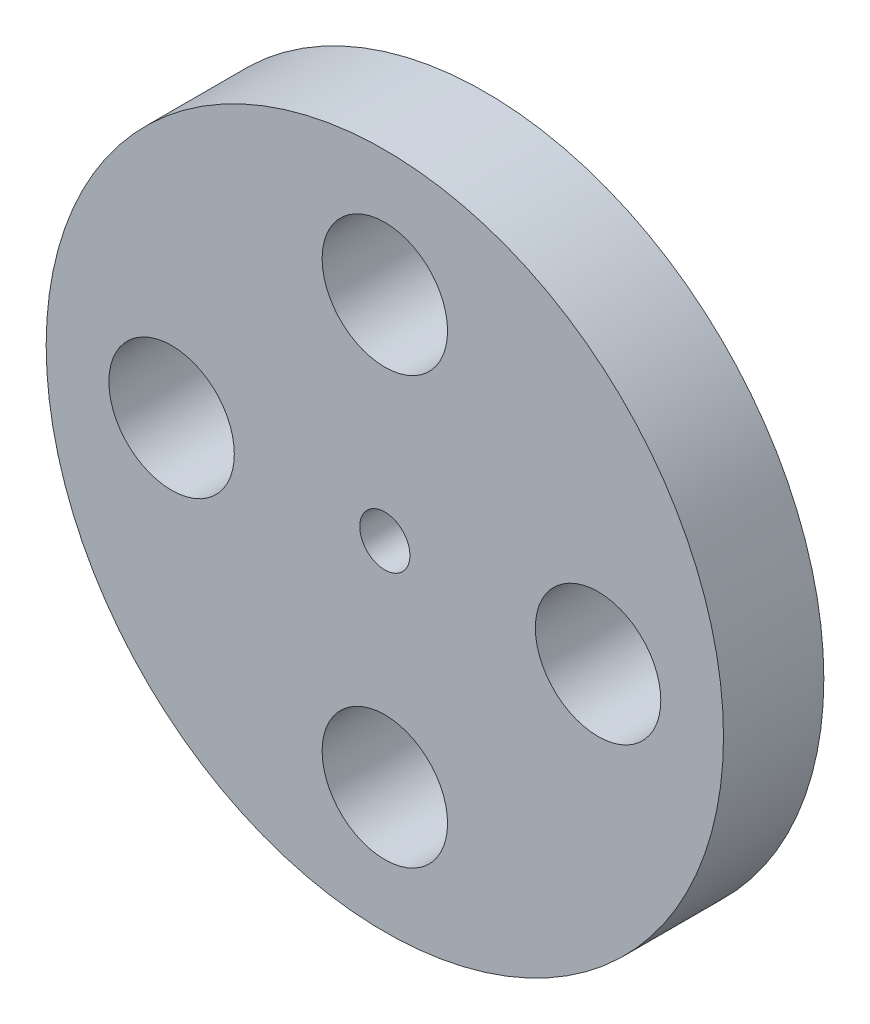
ISO-10303-21;
HEADER;
FILE_DESCRIPTION(('STEP AP214'),'2;1');
FILE_NAME('part.step','',(''),(''),'','','');
FILE_SCHEMA(('AUTOMOTIVE_DESIGN { 1 0 10303 214 1 1 1 1 }'));
ENDSEC;
DATA;
#1=APPLICATION_CONTEXT('core data for automotive mechanical design processes');
#2=APPLICATION_PROTOCOL_DEFINITION('international standard','automotive_design',2000,#1);
#3=PRODUCT_CONTEXT('',#1,'mechanical');
#4=PRODUCT('Part','Part','',(#3));
#5=PRODUCT_RELATED_PRODUCT_CATEGORY('part','',(#4));
#6=PRODUCT_DEFINITION_FORMATION('','',#4);
#7=PRODUCT_DEFINITION_CONTEXT('part definition',#1,'design');
#8=PRODUCT_DEFINITION('design','',#6,#7);
#9=PRODUCT_DEFINITION_SHAPE('','',#8);
#10=(LENGTH_UNIT() NAMED_UNIT(*) SI_UNIT(.MILLI.,.METRE.));
#11=(NAMED_UNIT(*) PLANE_ANGLE_UNIT() SI_UNIT($,.RADIAN.));
#12=(NAMED_UNIT(*) SI_UNIT($,.STERADIAN.) SOLID_ANGLE_UNIT());
#13=UNCERTAINTY_MEASURE_WITH_UNIT(LENGTH_MEASURE(1.E-05),#10,'distance_accuracy_value','');
#14=(GEOMETRIC_REPRESENTATION_CONTEXT(3) GLOBAL_UNCERTAINTY_ASSIGNED_CONTEXT((#13)) GLOBAL_UNIT_ASSIGNED_CONTEXT((#10,
#11,#12)) REPRESENTATION_CONTEXT('',''));
#15=CARTESIAN_POINT('',(0.,0.,0.));
#16=DIRECTION('',(0.,0.,1.));
#17=DIRECTION('',(1.,0.,0.));
#18=AXIS2_PLACEMENT_3D('',#15,#16,#17);
#19=CARTESIAN_POINT('',(0.,0.,4.));
#20=DIRECTION('',(0.,0.,-1.));
#21=DIRECTION('',(-1.,0.,0.));
#22=AXIS2_PLACEMENT_3D('',#19,#20,#21);
#23=CYLINDRICAL_SURFACE('',#22,13.5);
#24=CARTESIAN_POINT('',(0.,0.,4.));
#25=DIRECTION('',(0.,0.,1.));
#26=DIRECTION('',(1.,0.,0.));
#27=AXIS2_PLACEMENT_3D('',#24,#25,#26);
#28=CIRCLE('',#27,13.5);
#29=CARTESIAN_POINT('',(13.5,0.,4.));
#30=VERTEX_POINT('',#29);
#31=EDGE_CURVE('E10',#30,#30,#28,.T.);
#32=ORIENTED_EDGE('',*,*,#31,.F.);
#33=EDGE_LOOP('',(#32));
#34=FACE_BOUND('',#33,.T.);
#35=CARTESIAN_POINT('',(0.,0.,0.));
#36=DIRECTION('',(0.,0.,1.));
#37=DIRECTION('',(1.,0.,0.));
#38=AXIS2_PLACEMENT_3D('',#35,#36,#37);
#39=CIRCLE('',#38,13.5);
#40=CARTESIAN_POINT('',(13.5,0.,0.));
#41=VERTEX_POINT('',#40);
#42=EDGE_CURVE('E34',#41,#41,#39,.T.);
#43=ORIENTED_EDGE('',*,*,#42,.T.);
#44=EDGE_LOOP('',(#43));
#45=FACE_BOUND('',#44,.T.);
#46=ADVANCED_FACE('F31',(#34,#45),#23,.T.);
#47=CARTESIAN_POINT('',(0.,0.,4.));
#48=DIRECTION('',(0.,0.,1.));
#49=DIRECTION('',(1.,0.,0.));
#50=AXIS2_PLACEMENT_3D('',#47,#48,#49);
#51=PLANE('',#50);
#52=CARTESIAN_POINT('',(8.5,0.,4.));
#53=DIRECTION('',(0.,0.,1.));
#54=DIRECTION('',(1.,0.,0.));
#55=AXIS2_PLACEMENT_3D('',#52,#53,#54);
#56=CIRCLE('',#55,2.5);
#57=CARTESIAN_POINT('',(11.,0.,4.));
#58=VERTEX_POINT('',#57);
#59=EDGE_CURVE('E67',#58,#58,#56,.F.);
#60=ORIENTED_EDGE('',*,*,#59,.T.);
#61=EDGE_LOOP('',(#60));
#62=FACE_BOUND('',#61,.T.);
#63=CARTESIAN_POINT('',(-8.5,0.,4.));
#64=DIRECTION('',(0.,0.,1.));
#65=DIRECTION('',(1.,0.,0.));
#66=AXIS2_PLACEMENT_3D('',#63,#64,#65);
#67=CIRCLE('',#66,2.5);
#68=CARTESIAN_POINT('',(-6.,0.,4.));
#69=VERTEX_POINT('',#68);
#70=EDGE_CURVE('E61',#69,#69,#67,.F.);
#71=ORIENTED_EDGE('',*,*,#70,.T.);
#72=EDGE_LOOP('',(#71));
#73=FACE_BOUND('',#72,.T.);
#74=CARTESIAN_POINT('',(0.,-8.5,4.));
#75=DIRECTION('',(0.,0.,1.));
#76=DIRECTION('',(1.,0.,0.));
#77=AXIS2_PLACEMENT_3D('',#74,#75,#76);
#78=CIRCLE('',#77,2.5);
#79=CARTESIAN_POINT('',(2.5,-8.5,4.));
#80=VERTEX_POINT('',#79);
#81=EDGE_CURVE('E52',#80,#80,#78,.T.);
#82=ORIENTED_EDGE('',*,*,#81,.F.);
#83=EDGE_LOOP('',(#82));
#84=FACE_BOUND('',#83,.T.);
#85=CARTESIAN_POINT('',(0.,8.5,4.));
#86=DIRECTION('',(0.,0.,1.));
#87=DIRECTION('',(1.,0.,0.));
#88=AXIS2_PLACEMENT_3D('',#85,#86,#87);
#89=CIRCLE('',#88,2.5);
#90=CARTESIAN_POINT('',(2.5,8.5,4.));
#91=VERTEX_POINT('',#90);
#92=EDGE_CURVE('E49',#91,#91,#89,.F.);
#93=ORIENTED_EDGE('',*,*,#92,.T.);
#94=EDGE_LOOP('',(#93));
#95=FACE_BOUND('',#94,.T.);
#96=CARTESIAN_POINT('',(0.,0.,4.));
#97=DIRECTION('',(0.,0.,1.));
#98=DIRECTION('',(1.,0.,0.));
#99=AXIS2_PLACEMENT_3D('',#96,#97,#98);
#100=CIRCLE('',#99,1.);
#101=CARTESIAN_POINT('',(1.,0.,4.));
#102=VERTEX_POINT('',#101);
#103=EDGE_CURVE('E45',#102,#102,#100,.T.);
#104=ORIENTED_EDGE('',*,*,#103,.F.);
#105=EDGE_LOOP('',(#104));
#106=FACE_BOUND('',#105,.T.);
#107=ORIENTED_EDGE('',*,*,#31,.T.);
#108=EDGE_LOOP('',(#107));
#109=FACE_BOUND('',#108,.T.);
#110=ADVANCED_FACE('F79',(#62,#73,#84,#95,#106,#109),#51,.T.);
#111=CARTESIAN_POINT('',(0.,0.,0.));
#112=DIRECTION('',(0.,0.,1.));
#113=DIRECTION('',(1.,0.,0.));
#114=AXIS2_PLACEMENT_3D('',#111,#112,#113);
#115=PLANE('',#114);
#116=CARTESIAN_POINT('',(8.5,0.,0.));
#117=DIRECTION('',(0.,0.,-1.));
#118=DIRECTION('',(-1.,0.,0.));
#119=AXIS2_PLACEMENT_3D('',#116,#117,#118);
#120=CIRCLE('',#119,2.5);
#121=CARTESIAN_POINT('',(6.,0.,0.));
#122=VERTEX_POINT('',#121);
#123=EDGE_CURVE('E64',#122,#122,#120,.T.);
#124=ORIENTED_EDGE('',*,*,#123,.F.);
#125=EDGE_LOOP('',(#124));
#126=FACE_BOUND('',#125,.T.);
#127=CARTESIAN_POINT('',(-8.5,0.,0.));
#128=DIRECTION('',(0.,0.,-1.));
#129=DIRECTION('',(-1.,0.,0.));
#130=AXIS2_PLACEMENT_3D('',#127,#128,#129);
#131=CIRCLE('',#130,2.5);
#132=CARTESIAN_POINT('',(-11.,0.,0.));
#133=VERTEX_POINT('',#132);
#134=EDGE_CURVE('E60',#133,#133,#131,.T.);
#135=ORIENTED_EDGE('',*,*,#134,.F.);
#136=EDGE_LOOP('',(#135));
#137=FACE_BOUND('',#136,.T.);
#138=CARTESIAN_POINT('',(0.,-8.5,0.));
#139=DIRECTION('',(0.,0.,1.));
#140=DIRECTION('',(-1.,0.,0.));
#141=AXIS2_PLACEMENT_3D('',#138,#139,#140);
#142=CIRCLE('',#141,2.5);
#143=CARTESIAN_POINT('',(-2.5,-8.5,0.));
#144=VERTEX_POINT('',#143);
#145=EDGE_CURVE('E57',#144,#144,#142,.T.);
#146=ORIENTED_EDGE('',*,*,#145,.T.);
#147=EDGE_LOOP('',(#146));
#148=FACE_BOUND('',#147,.T.);
#149=CARTESIAN_POINT('',(0.,8.5,0.));
#150=DIRECTION('',(0.,0.,-1.));
#151=DIRECTION('',(-1.,0.,0.));
#152=AXIS2_PLACEMENT_3D('',#149,#150,#151);
#153=CIRCLE('',#152,2.5);
#154=CARTESIAN_POINT('',(-2.5,8.5,0.));
#155=VERTEX_POINT('',#154);
#156=EDGE_CURVE('E48',#155,#155,#153,.T.);
#157=ORIENTED_EDGE('',*,*,#156,.F.);
#158=EDGE_LOOP('',(#157));
#159=FACE_BOUND('',#158,.T.);
#160=CARTESIAN_POINT('',(0.,0.,0.));
#161=DIRECTION('',(0.,0.,1.));
#162=DIRECTION('',(1.,0.,0.));
#163=AXIS2_PLACEMENT_3D('',#160,#161,#162);
#164=CIRCLE('',#163,1.);
#165=CARTESIAN_POINT('',(1.,0.,0.));
#166=VERTEX_POINT('',#165);
#167=EDGE_CURVE('E41',#166,#166,#164,.F.);
#168=ORIENTED_EDGE('',*,*,#167,.F.);
#169=EDGE_LOOP('',(#168));
#170=FACE_BOUND('',#169,.T.);
#171=ORIENTED_EDGE('',*,*,#42,.F.);
#172=EDGE_LOOP('',(#171));
#173=FACE_BOUND('',#172,.T.);
#174=ADVANCED_FACE('F75',(#126,#137,#148,#159,#170,#173),#115,.F.);
#175=CARTESIAN_POINT('',(0.,0.,-0.00100000000000013));
#176=DIRECTION('',(0.,0.,1.));
#177=DIRECTION('',(1.,0.,0.));
#178=AXIS2_PLACEMENT_3D('',#175,#176,#177);
#179=CYLINDRICAL_SURFACE('',#178,1.);
#180=ORIENTED_EDGE('',*,*,#103,.T.);
#181=EDGE_LOOP('',(#180));
#182=FACE_BOUND('',#181,.T.);
#183=ORIENTED_EDGE('',*,*,#167,.T.);
#184=EDGE_LOOP('',(#183));
#185=FACE_BOUND('',#184,.T.);
#186=ADVANCED_FACE('F78',(#182,#185),#179,.F.);
#187=CARTESIAN_POINT('',(0.,8.5,4.001));
#188=DIRECTION('',(0.,0.,-1.));
#189=DIRECTION('',(-1.,0.,0.));
#190=AXIS2_PLACEMENT_3D('',#187,#188,#189);
#191=CYLINDRICAL_SURFACE('',#190,2.5);
#192=ORIENTED_EDGE('',*,*,#92,.F.);
#193=EDGE_LOOP('',(#192));
#194=FACE_BOUND('',#193,.T.);
#195=ORIENTED_EDGE('',*,*,#156,.T.);
#196=EDGE_LOOP('',(#195));
#197=FACE_BOUND('',#196,.T.);
#198=ADVANCED_FACE('F103',(#194,#197),#191,.F.);
#199=CARTESIAN_POINT('',(0.,-8.5,4.001));
#200=DIRECTION('',(0.,0.,-1.));
#201=DIRECTION('',(-1.,0.,0.));
#202=AXIS2_PLACEMENT_3D('',#199,#200,#201);
#203=CYLINDRICAL_SURFACE('',#202,2.5);
#204=ORIENTED_EDGE('',*,*,#81,.T.);
#205=EDGE_LOOP('',(#204));
#206=FACE_BOUND('',#205,.T.);
#207=ORIENTED_EDGE('',*,*,#145,.F.);
#208=EDGE_LOOP('',(#207));
#209=FACE_BOUND('',#208,.T.);
#210=ADVANCED_FACE('F107',(#206,#209),#203,.F.);
#211=CARTESIAN_POINT('',(-8.5,0.,4.001));
#212=DIRECTION('',(0.,0.,-1.));
#213=DIRECTION('',(-1.,0.,0.));
#214=AXIS2_PLACEMENT_3D('',#211,#212,#213);
#215=CYLINDRICAL_SURFACE('',#214,2.5);
#216=ORIENTED_EDGE('',*,*,#70,.F.);
#217=EDGE_LOOP('',(#216));
#218=FACE_BOUND('',#217,.T.);
#219=ORIENTED_EDGE('',*,*,#134,.T.);
#220=EDGE_LOOP('',(#219));
#221=FACE_BOUND('',#220,.T.);
#222=ADVANCED_FACE('F111',(#218,#221),#215,.F.);
#223=CARTESIAN_POINT('',(8.5,0.,4.001));
#224=DIRECTION('',(0.,0.,-1.));
#225=DIRECTION('',(-1.,0.,0.));
#226=AXIS2_PLACEMENT_3D('',#223,#224,#225);
#227=CYLINDRICAL_SURFACE('',#226,2.5);
#228=ORIENTED_EDGE('',*,*,#59,.F.);
#229=EDGE_LOOP('',(#228));
#230=FACE_BOUND('',#229,.T.);
#231=ORIENTED_EDGE('',*,*,#123,.T.);
#232=EDGE_LOOP('',(#231));
#233=FACE_BOUND('',#232,.T.);
#234=ADVANCED_FACE('F73',(#230,#233),#227,.F.);
#235=CLOSED_SHELL('',(#46,#110,#174,#186,#198,#210,#222,#234));
#236=MANIFOLD_SOLID_BREP('B2',#235);
#237=ADVANCED_BREP_SHAPE_REPRESENTATION('',(#18,#236),#14);
#238=SHAPE_DEFINITION_REPRESENTATION(#9,#237);
ENDSEC;
END-ISO-10303-21;
